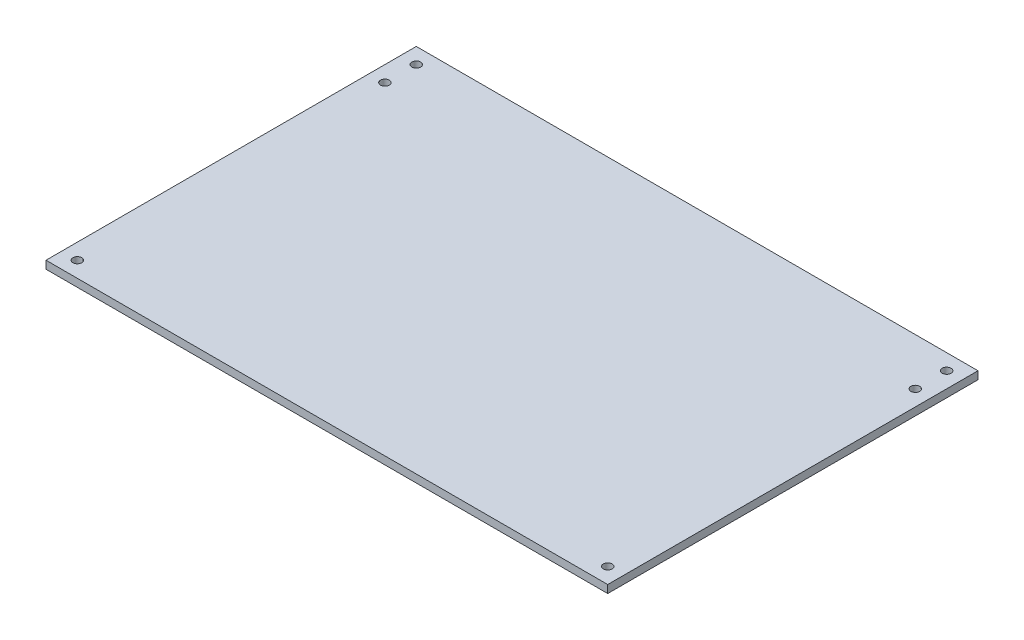
ISO-10303-21;
HEADER;
FILE_DESCRIPTION(('STEP AP214'),'2;1');
FILE_NAME('part.step','',(''),(''),'','','');
FILE_SCHEMA(('AUTOMOTIVE_DESIGN { 1 0 10303 214 1 1 1 1 }'));
ENDSEC;
DATA;
#1=APPLICATION_CONTEXT('core data for automotive mechanical design processes');
#2=APPLICATION_PROTOCOL_DEFINITION('international standard','automotive_design',2000,#1);
#3=PRODUCT_CONTEXT('',#1,'mechanical');
#4=PRODUCT('Part','Part','',(#3));
#5=PRODUCT_RELATED_PRODUCT_CATEGORY('part','',(#4));
#6=PRODUCT_DEFINITION_FORMATION('','',#4);
#7=PRODUCT_DEFINITION_CONTEXT('part definition',#1,'design');
#8=PRODUCT_DEFINITION('design','',#6,#7);
#9=PRODUCT_DEFINITION_SHAPE('','',#8);
#10=(LENGTH_UNIT() NAMED_UNIT(*) SI_UNIT(.MILLI.,.METRE.));
#11=(NAMED_UNIT(*) PLANE_ANGLE_UNIT() SI_UNIT($,.RADIAN.));
#12=(NAMED_UNIT(*) SI_UNIT($,.STERADIAN.) SOLID_ANGLE_UNIT());
#13=UNCERTAINTY_MEASURE_WITH_UNIT(LENGTH_MEASURE(1.E-05),#10,'distance_accuracy_value','');
#14=(GEOMETRIC_REPRESENTATION_CONTEXT(3) GLOBAL_UNCERTAINTY_ASSIGNED_CONTEXT((#13)) GLOBAL_UNIT_ASSIGNED_CONTEXT((#10,
#11,#12)) REPRESENTATION_CONTEXT('',''));
#15=CARTESIAN_POINT('',(0.,0.,0.));
#16=DIRECTION('',(0.,0.,1.));
#17=DIRECTION('',(1.,0.,0.));
#18=AXIS2_PLACEMENT_3D('',#15,#16,#17);
#19=CARTESIAN_POINT('',(0.,25.4,-150.));
#20=DIRECTION('',(0.,0.,-1.));
#21=DIRECTION('',(-1.,0.,0.));
#22=AXIS2_PLACEMENT_3D('',#19,#20,#21);
#23=PLANE('',#22);
#24=DIRECTION('',(1.,0.,0.));
#25=VECTOR('',#24,1.);
#26=CARTESIAN_POINT('',(0.,19.05,-150.));
#27=LINE('',#26,#25);
#28=CARTESIAN_POINT('',(300.,19.05,-150.));
#29=VERTEX_POINT('',#28);
#30=CARTESIAN_POINT('',(755.092,19.05,-150.));
#31=VERTEX_POINT('',#30);
#32=EDGE_CURVE('E110',#29,#31,#27,.T.);
#33=ORIENTED_EDGE('',*,*,#32,.F.);
#34=DIRECTION('',(0.,-1.,0.));
#35=VECTOR('',#34,1.);
#36=CARTESIAN_POINT('',(300.,25.4,-150.));
#37=LINE('',#36,#35);
#38=CARTESIAN_POINT('',(300.,25.4,-150.));
#39=VERTEX_POINT('',#38);
#40=EDGE_CURVE('E11',#39,#29,#37,.T.);
#41=ORIENTED_EDGE('',*,*,#40,.F.);
#42=DIRECTION('',(1.,0.,0.));
#43=VECTOR('',#42,1.);
#44=CARTESIAN_POINT('',(0.,25.4,-150.));
#45=LINE('',#44,#43);
#46=CARTESIAN_POINT('',(755.092,25.4,-150.));
#47=VERTEX_POINT('',#46);
#48=EDGE_CURVE('E100',#39,#47,#45,.T.);
#49=ORIENTED_EDGE('',*,*,#48,.T.);
#50=DIRECTION('',(0.,-1.,0.));
#51=VECTOR('',#50,1.);
#52=CARTESIAN_POINT('',(755.092,25.4,-150.));
#53=LINE('',#52,#51);
#54=EDGE_CURVE('E58',#47,#31,#53,.T.);
#55=ORIENTED_EDGE('',*,*,#54,.T.);
#56=EDGE_LOOP('',(#33,#41,#49,#55));
#57=FACE_BOUND('',#56,.T.);
#58=ADVANCED_FACE('F42',(#57),#23,.T.);
#59=CARTESIAN_POINT('',(300.,25.4,0.));
#60=DIRECTION('',(-1.,0.,0.));
#61=DIRECTION('',(0.,0.,1.));
#62=AXIS2_PLACEMENT_3D('',#59,#60,#61);
#63=PLANE('',#62);
#64=DIRECTION('',(0.,0.,-1.));
#65=VECTOR('',#64,1.);
#66=CARTESIAN_POINT('',(300.,19.05,0.));
#67=LINE('',#66,#65);
#68=CARTESIAN_POINT('',(300.,19.05,150.));
#69=VERTEX_POINT('',#68);
#70=EDGE_CURVE('E89',#69,#29,#67,.T.);
#71=ORIENTED_EDGE('',*,*,#70,.F.);
#72=DIRECTION('',(0.,-1.,0.));
#73=VECTOR('',#72,1.);
#74=CARTESIAN_POINT('',(300.,25.4,150.));
#75=LINE('',#74,#73);
#76=CARTESIAN_POINT('',(300.,25.4,150.));
#77=VERTEX_POINT('',#76);
#78=EDGE_CURVE('E55',#77,#69,#75,.T.);
#79=ORIENTED_EDGE('',*,*,#78,.F.);
#80=DIRECTION('',(0.,0.,-1.));
#81=VECTOR('',#80,1.);
#82=CARTESIAN_POINT('',(300.,25.4,0.));
#83=LINE('',#82,#81);
#84=EDGE_CURVE('E87',#77,#39,#83,.T.);
#85=ORIENTED_EDGE('',*,*,#84,.T.);
#86=ORIENTED_EDGE('',*,*,#40,.T.);
#87=EDGE_LOOP('',(#71,#79,#85,#86));
#88=FACE_BOUND('',#87,.T.);
#89=ADVANCED_FACE('F90',(#88),#63,.T.);
#90=CARTESIAN_POINT('',(0.,25.4,150.));
#91=DIRECTION('',(0.,0.,1.));
#92=DIRECTION('',(1.,0.,0.));
#93=AXIS2_PLACEMENT_3D('',#90,#91,#92);
#94=PLANE('',#93);
#95=DIRECTION('',(-1.,0.,0.));
#96=VECTOR('',#95,1.);
#97=CARTESIAN_POINT('',(0.,19.05,150.));
#98=LINE('',#97,#96);
#99=CARTESIAN_POINT('',(755.092,19.05,150.));
#100=VERTEX_POINT('',#99);
#101=EDGE_CURVE('E111',#100,#69,#98,.T.);
#102=ORIENTED_EDGE('',*,*,#101,.F.);
#103=DIRECTION('',(0.,-1.,0.));
#104=VECTOR('',#103,1.);
#105=CARTESIAN_POINT('',(755.092,25.4,150.));
#106=LINE('',#105,#104);
#107=CARTESIAN_POINT('',(755.092,25.4,150.));
#108=VERTEX_POINT('',#107);
#109=EDGE_CURVE('E71',#108,#100,#106,.T.);
#110=ORIENTED_EDGE('',*,*,#109,.F.);
#111=DIRECTION('',(-1.,0.,0.));
#112=VECTOR('',#111,1.);
#113=CARTESIAN_POINT('',(0.,25.4,150.));
#114=LINE('',#113,#112);
#115=EDGE_CURVE('E96',#108,#77,#114,.T.);
#116=ORIENTED_EDGE('',*,*,#115,.T.);
#117=ORIENTED_EDGE('',*,*,#78,.T.);
#118=EDGE_LOOP('',(#102,#110,#116,#117));
#119=FACE_BOUND('',#118,.T.);
#120=ADVANCED_FACE('F103',(#119),#94,.T.);
#121=CARTESIAN_POINT('',(755.092,25.4,-1.50655139565147E-13));
#122=DIRECTION('',(1.,0.,0.));
#123=DIRECTION('',(0.,0.,-1.));
#124=AXIS2_PLACEMENT_3D('',#121,#122,#123);
#125=PLANE('',#124);
#126=DIRECTION('',(0.,0.,1.));
#127=VECTOR('',#126,1.);
#128=CARTESIAN_POINT('',(755.092,19.05,-1.50655139565147E-13));
#129=LINE('',#128,#127);
#130=EDGE_CURVE('E113',#31,#100,#129,.T.);
#131=ORIENTED_EDGE('',*,*,#130,.F.);
#132=ORIENTED_EDGE('',*,*,#54,.F.);
#133=DIRECTION('',(0.,0.,1.));
#134=VECTOR('',#133,1.);
#135=CARTESIAN_POINT('',(755.092,25.4,-1.50655139565147E-13));
#136=LINE('',#135,#134);
#137=EDGE_CURVE('E105',#47,#108,#136,.T.);
#138=ORIENTED_EDGE('',*,*,#137,.T.);
#139=ORIENTED_EDGE('',*,*,#109,.T.);
#140=EDGE_LOOP('',(#131,#132,#138,#139));
#141=FACE_BOUND('',#140,.T.);
#142=ADVANCED_FACE('F157',(#141),#125,.T.);
#143=CARTESIAN_POINT('',(0.,25.4,0.));
#144=DIRECTION('',(0.,1.,0.));
#145=DIRECTION('',(0.,0.,1.));
#146=AXIS2_PLACEMENT_3D('',#143,#144,#145);
#147=PLANE('',#146);
#148=CARTESIAN_POINT('',(312.7,25.4,-111.9));
#149=DIRECTION('',(0.,1.,0.));
#150=DIRECTION('',(0.,0.,1.));
#151=AXIS2_PLACEMENT_3D('',#148,#149,#150);
#152=CIRCLE('',#151,3.56869999999998);
#153=CARTESIAN_POINT('',(312.7,25.4,-108.3313));
#154=VERTEX_POINT('',#153);
#155=EDGE_CURVE('E151',#154,#154,#152,.T.);
#156=ORIENTED_EDGE('',*,*,#155,.F.);
#157=EDGE_LOOP('',(#156));
#158=FACE_BOUND('',#157,.T.);
#159=CARTESIAN_POINT('',(312.7,25.4,-137.3));
#160=DIRECTION('',(0.,1.,0.));
#161=DIRECTION('',(0.,0.,1.));
#162=AXIS2_PLACEMENT_3D('',#159,#160,#161);
#163=CIRCLE('',#162,3.56869999999998);
#164=CARTESIAN_POINT('',(312.7,25.4,-133.7313));
#165=VERTEX_POINT('',#164);
#166=EDGE_CURVE('E143',#165,#165,#163,.T.);
#167=ORIENTED_EDGE('',*,*,#166,.F.);
#168=EDGE_LOOP('',(#167));
#169=FACE_BOUND('',#168,.T.);
#170=CARTESIAN_POINT('',(312.7,25.4,137.3));
#171=DIRECTION('',(0.,1.,0.));
#172=DIRECTION('',(0.,0.,1.));
#173=AXIS2_PLACEMENT_3D('',#170,#171,#172);
#174=CIRCLE('',#173,3.56869999999998);
#175=CARTESIAN_POINT('',(312.7,25.4,140.8687));
#176=VERTEX_POINT('',#175);
#177=EDGE_CURVE('E139',#176,#176,#174,.T.);
#178=ORIENTED_EDGE('',*,*,#177,.F.);
#179=EDGE_LOOP('',(#178));
#180=FACE_BOUND('',#179,.T.);
#181=CARTESIAN_POINT('',(742.392,25.4,137.3));
#182=DIRECTION('',(0.,1.,0.));
#183=DIRECTION('',(0.,0.,1.));
#184=AXIS2_PLACEMENT_3D('',#181,#182,#183);
#185=CIRCLE('',#184,3.56869999999998);
#186=CARTESIAN_POINT('',(742.392,25.4,140.8687));
#187=VERTEX_POINT('',#186);
#188=EDGE_CURVE('E132',#187,#187,#185,.T.);
#189=ORIENTED_EDGE('',*,*,#188,.F.);
#190=EDGE_LOOP('',(#189));
#191=FACE_BOUND('',#190,.T.);
#192=CARTESIAN_POINT('',(742.392,25.4,-111.9));
#193=DIRECTION('',(0.,1.,0.));
#194=DIRECTION('',(0.,0.,1.));
#195=AXIS2_PLACEMENT_3D('',#192,#193,#194);
#196=CIRCLE('',#195,3.56869999999998);
#197=CARTESIAN_POINT('',(742.392,25.4,-108.3313));
#198=VERTEX_POINT('',#197);
#199=EDGE_CURVE('E126',#198,#198,#196,.T.);
#200=ORIENTED_EDGE('',*,*,#199,.F.);
#201=EDGE_LOOP('',(#200));
#202=FACE_BOUND('',#201,.T.);
#203=CARTESIAN_POINT('',(742.392,25.4,-137.3));
#204=DIRECTION('',(0.,1.,0.));
#205=DIRECTION('',(0.,0.,1.));
#206=AXIS2_PLACEMENT_3D('',#203,#204,#205);
#207=CIRCLE('',#206,3.56869999999998);
#208=CARTESIAN_POINT('',(742.392,25.4,-133.7313));
#209=VERTEX_POINT('',#208);
#210=EDGE_CURVE('E122',#209,#209,#207,.T.);
#211=ORIENTED_EDGE('',*,*,#210,.F.);
#212=EDGE_LOOP('',(#211));
#213=FACE_BOUND('',#212,.T.);
#214=ORIENTED_EDGE('',*,*,#48,.F.);
#215=ORIENTED_EDGE('',*,*,#84,.F.);
#216=ORIENTED_EDGE('',*,*,#115,.F.);
#217=ORIENTED_EDGE('',*,*,#137,.F.);
#218=EDGE_LOOP('',(#214,#215,#216,#217));
#219=FACE_BOUND('',#218,.T.);
#220=ADVANCED_FACE('F98',(#158,#169,#180,#191,#202,#213,#219),#147,.T.);
#221=CARTESIAN_POINT('',(0.,19.05,0.));
#222=DIRECTION('',(0.,1.,0.));
#223=DIRECTION('',(0.,0.,1.));
#224=AXIS2_PLACEMENT_3D('',#221,#222,#223);
#225=PLANE('',#224);
#226=CARTESIAN_POINT('',(312.7,19.05,-111.9));
#227=DIRECTION('',(0.,1.,0.));
#228=DIRECTION('',(0.,0.,1.));
#229=AXIS2_PLACEMENT_3D('',#226,#227,#228);
#230=CIRCLE('',#229,3.56869999999998);
#231=CARTESIAN_POINT('',(312.7,19.05,-108.3313));
#232=VERTEX_POINT('',#231);
#233=EDGE_CURVE('E150',#232,#232,#230,.T.);
#234=ORIENTED_EDGE('',*,*,#233,.T.);
#235=EDGE_LOOP('',(#234));
#236=FACE_BOUND('',#235,.T.);
#237=CARTESIAN_POINT('',(312.7,19.05,-137.3));
#238=DIRECTION('',(0.,1.,0.));
#239=DIRECTION('',(0.,0.,1.));
#240=AXIS2_PLACEMENT_3D('',#237,#238,#239);
#241=CIRCLE('',#240,3.56869999999998);
#242=CARTESIAN_POINT('',(312.7,19.05,-133.7313));
#243=VERTEX_POINT('',#242);
#244=EDGE_CURVE('E145',#243,#243,#241,.T.);
#245=ORIENTED_EDGE('',*,*,#244,.T.);
#246=EDGE_LOOP('',(#245));
#247=FACE_BOUND('',#246,.T.);
#248=CARTESIAN_POINT('',(312.7,19.05,137.3));
#249=DIRECTION('',(0.,1.,0.));
#250=DIRECTION('',(0.,0.,1.));
#251=AXIS2_PLACEMENT_3D('',#248,#249,#250);
#252=CIRCLE('',#251,3.56869999999998);
#253=CARTESIAN_POINT('',(312.7,19.05,140.8687));
#254=VERTEX_POINT('',#253);
#255=EDGE_CURVE('E138',#254,#254,#252,.T.);
#256=ORIENTED_EDGE('',*,*,#255,.T.);
#257=EDGE_LOOP('',(#256));
#258=FACE_BOUND('',#257,.T.);
#259=CARTESIAN_POINT('',(742.392,19.05,137.3));
#260=DIRECTION('',(0.,1.,0.));
#261=DIRECTION('',(0.,0.,1.));
#262=AXIS2_PLACEMENT_3D('',#259,#260,#261);
#263=CIRCLE('',#262,3.56869999999998);
#264=CARTESIAN_POINT('',(742.392,19.05,140.8687));
#265=VERTEX_POINT('',#264);
#266=EDGE_CURVE('E127',#265,#265,#263,.T.);
#267=ORIENTED_EDGE('',*,*,#266,.T.);
#268=EDGE_LOOP('',(#267));
#269=FACE_BOUND('',#268,.T.);
#270=CARTESIAN_POINT('',(742.392,19.05,-111.9));
#271=DIRECTION('',(0.,1.,0.));
#272=DIRECTION('',(0.,0.,1.));
#273=AXIS2_PLACEMENT_3D('',#270,#271,#272);
#274=CIRCLE('',#273,3.56869999999998);
#275=CARTESIAN_POINT('',(742.392,19.05,-108.3313));
#276=VERTEX_POINT('',#275);
#277=EDGE_CURVE('E121',#276,#276,#274,.T.);
#278=ORIENTED_EDGE('',*,*,#277,.T.);
#279=EDGE_LOOP('',(#278));
#280=FACE_BOUND('',#279,.T.);
#281=CARTESIAN_POINT('',(742.392,19.05,-137.3));
#282=DIRECTION('',(0.,1.,0.));
#283=DIRECTION('',(0.,0.,1.));
#284=AXIS2_PLACEMENT_3D('',#281,#282,#283);
#285=CIRCLE('',#284,3.56869999999998);
#286=CARTESIAN_POINT('',(742.392,19.05,-133.7313));
#287=VERTEX_POINT('',#286);
#288=EDGE_CURVE('E107',#287,#287,#285,.T.);
#289=ORIENTED_EDGE('',*,*,#288,.T.);
#290=EDGE_LOOP('',(#289));
#291=FACE_BOUND('',#290,.T.);
#292=ORIENTED_EDGE('',*,*,#32,.T.);
#293=ORIENTED_EDGE('',*,*,#130,.T.);
#294=ORIENTED_EDGE('',*,*,#101,.T.);
#295=ORIENTED_EDGE('',*,*,#70,.T.);
#296=EDGE_LOOP('',(#292,#293,#294,#295));
#297=FACE_BOUND('',#296,.T.);
#298=ADVANCED_FACE('F159',(#236,#247,#258,#269,#280,#291,#297),#225,.F.);
#299=CARTESIAN_POINT('',(742.392,25.4,-137.3));
#300=DIRECTION('',(0.,1.,0.));
#301=DIRECTION('',(0.,0.,1.));
#302=AXIS2_PLACEMENT_3D('',#299,#300,#301);
#303=CYLINDRICAL_SURFACE('',#302,3.56869999999998);
#304=ORIENTED_EDGE('',*,*,#288,.F.);
#305=EDGE_LOOP('',(#304));
#306=FACE_BOUND('',#305,.T.);
#307=ORIENTED_EDGE('',*,*,#210,.T.);
#308=EDGE_LOOP('',(#307));
#309=FACE_BOUND('',#308,.T.);
#310=ADVANCED_FACE('F175',(#306,#309),#303,.F.);
#311=CARTESIAN_POINT('',(742.392,25.4,-111.9));
#312=DIRECTION('',(0.,1.,0.));
#313=DIRECTION('',(0.,0.,1.));
#314=AXIS2_PLACEMENT_3D('',#311,#312,#313);
#315=CYLINDRICAL_SURFACE('',#314,3.56869999999998);
#316=ORIENTED_EDGE('',*,*,#277,.F.);
#317=EDGE_LOOP('',(#316));
#318=FACE_BOUND('',#317,.T.);
#319=ORIENTED_EDGE('',*,*,#199,.T.);
#320=EDGE_LOOP('',(#319));
#321=FACE_BOUND('',#320,.T.);
#322=ADVANCED_FACE('F172',(#318,#321),#315,.F.);
#323=CARTESIAN_POINT('',(742.392,25.4,137.3));
#324=DIRECTION('',(0.,1.,0.));
#325=DIRECTION('',(0.,0.,1.));
#326=AXIS2_PLACEMENT_3D('',#323,#324,#325);
#327=CYLINDRICAL_SURFACE('',#326,3.56869999999998);
#328=ORIENTED_EDGE('',*,*,#266,.F.);
#329=EDGE_LOOP('',(#328));
#330=FACE_BOUND('',#329,.T.);
#331=ORIENTED_EDGE('',*,*,#188,.T.);
#332=EDGE_LOOP('',(#331));
#333=FACE_BOUND('',#332,.T.);
#334=ADVANCED_FACE('F181',(#330,#333),#327,.F.);
#335=CARTESIAN_POINT('',(312.7,25.4,137.3));
#336=DIRECTION('',(0.,1.,0.));
#337=DIRECTION('',(0.,0.,1.));
#338=AXIS2_PLACEMENT_3D('',#335,#336,#337);
#339=CYLINDRICAL_SURFACE('',#338,3.56869999999998);
#340=ORIENTED_EDGE('',*,*,#255,.F.);
#341=EDGE_LOOP('',(#340));
#342=FACE_BOUND('',#341,.T.);
#343=ORIENTED_EDGE('',*,*,#177,.T.);
#344=EDGE_LOOP('',(#343));
#345=FACE_BOUND('',#344,.T.);
#346=ADVANCED_FACE('F241',(#342,#345),#339,.F.);
#347=CARTESIAN_POINT('',(312.7,25.4,-137.3));
#348=DIRECTION('',(0.,1.,0.));
#349=DIRECTION('',(0.,0.,1.));
#350=AXIS2_PLACEMENT_3D('',#347,#348,#349);
#351=CYLINDRICAL_SURFACE('',#350,3.56869999999998);
#352=ORIENTED_EDGE('',*,*,#244,.F.);
#353=EDGE_LOOP('',(#352));
#354=FACE_BOUND('',#353,.T.);
#355=ORIENTED_EDGE('',*,*,#166,.T.);
#356=EDGE_LOOP('',(#355));
#357=FACE_BOUND('',#356,.T.);
#358=ADVANCED_FACE('F249',(#354,#357),#351,.F.);
#359=CARTESIAN_POINT('',(312.7,25.4,-111.9));
#360=DIRECTION('',(0.,1.,0.));
#361=DIRECTION('',(0.,0.,1.));
#362=AXIS2_PLACEMENT_3D('',#359,#360,#361);
#363=CYLINDRICAL_SURFACE('',#362,3.56869999999998);
#364=ORIENTED_EDGE('',*,*,#233,.F.);
#365=EDGE_LOOP('',(#364));
#366=FACE_BOUND('',#365,.T.);
#367=ORIENTED_EDGE('',*,*,#155,.T.);
#368=EDGE_LOOP('',(#367));
#369=FACE_BOUND('',#368,.T.);
#370=ADVANCED_FACE('F154',(#366,#369),#363,.F.);
#371=CLOSED_SHELL('',(#58,#89,#120,#142,#220,#298,#310,#322,#334,#346,#358,#370));
#372=MANIFOLD_SOLID_BREP('B2',#371);
#373=ADVANCED_BREP_SHAPE_REPRESENTATION('',(#18,#372),#14);
#374=SHAPE_DEFINITION_REPRESENTATION(#9,#373);
ENDSEC;
END-ISO-10303-21;
